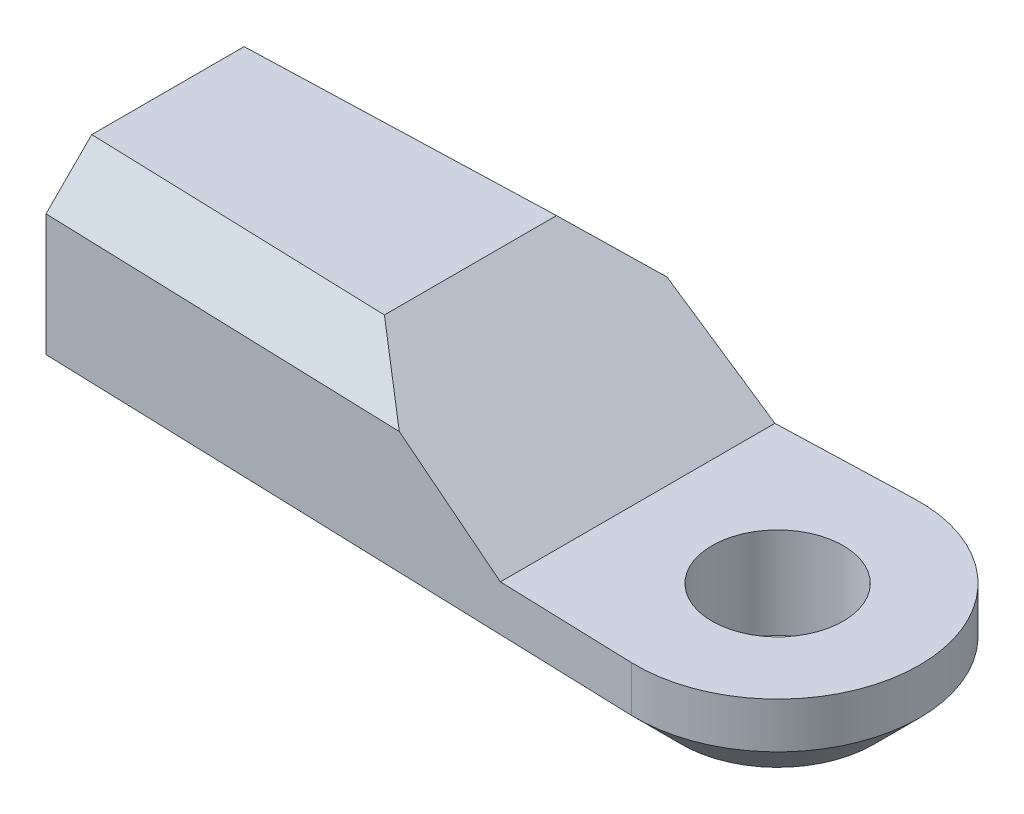
ISO-10303-21;
HEADER;
FILE_DESCRIPTION(('STEP AP214'),'2;1');
FILE_NAME('part.step','',(''),(''),'','','');
FILE_SCHEMA(('AUTOMOTIVE_DESIGN { 1 0 10303 214 1 1 1 1 }'));
ENDSEC;
DATA;
#1=APPLICATION_CONTEXT('core data for automotive mechanical design processes');
#2=APPLICATION_PROTOCOL_DEFINITION('international standard','automotive_design',2000,#1);
#3=PRODUCT_CONTEXT('',#1,'mechanical');
#4=PRODUCT('Part','Part','',(#3));
#5=PRODUCT_RELATED_PRODUCT_CATEGORY('part','',(#4));
#6=PRODUCT_DEFINITION_FORMATION('','',#4);
#7=PRODUCT_DEFINITION_CONTEXT('part definition',#1,'design');
#8=PRODUCT_DEFINITION('design','',#6,#7);
#9=PRODUCT_DEFINITION_SHAPE('','',#8);
#10=(LENGTH_UNIT() NAMED_UNIT(*) SI_UNIT(.MILLI.,.METRE.));
#11=(NAMED_UNIT(*) PLANE_ANGLE_UNIT() SI_UNIT($,.RADIAN.));
#12=(NAMED_UNIT(*) SI_UNIT($,.STERADIAN.) SOLID_ANGLE_UNIT());
#13=UNCERTAINTY_MEASURE_WITH_UNIT(LENGTH_MEASURE(1.E-05),#10,'distance_accuracy_value','');
#14=(GEOMETRIC_REPRESENTATION_CONTEXT(3) GLOBAL_UNCERTAINTY_ASSIGNED_CONTEXT((#13)) GLOBAL_UNIT_ASSIGNED_CONTEXT((#10,
#11,#12)) REPRESENTATION_CONTEXT('',''));
#15=CARTESIAN_POINT('',(0.,0.,0.));
#16=DIRECTION('',(0.,0.,1.));
#17=DIRECTION('',(1.,0.,0.));
#18=AXIS2_PLACEMENT_3D('',#15,#16,#17);
#19=CARTESIAN_POINT('',(-0.130356031743456,7.,3.99574730489311));
#20=DIRECTION('',(0.032606345651166,0.,-0.999468271744169));
#21=DIRECTION('',(-0.999468271744169,0.,-0.032606345651166));
#22=AXIS2_PLACEMENT_3D('',#19,#20,#21);
#23=PLANE('',#22);
#24=DIRECTION('',(0.,-1.,0.));
#25=VECTOR('',#24,1.);
#26=CARTESIAN_POINT('',(0.,7.,4.));
#27=LINE('',#26,#25);
#28=CARTESIAN_POINT('',(0.,5.5,4.));
#29=VERTEX_POINT('',#28);
#30=CARTESIAN_POINT('',(0.,1.5,4.));
#31=VERTEX_POINT('',#30);
#32=EDGE_CURVE('E154',#29,#31,#27,.T.);
#33=ORIENTED_EDGE('',*,*,#32,.T.);
#34=DIRECTION('',(0.999468271744169,0.,0.032606345651166));
#35=VECTOR('',#34,1.);
#36=CARTESIAN_POINT('',(-0.130356031743456,1.5,3.99574730489311));
#37=LINE('',#36,#35);
#38=CARTESIAN_POINT('',(19.8483804927221,1.5,4.64752746361039));
#39=VERTEX_POINT('',#38);
#40=EDGE_CURVE('E174',#31,#39,#37,.T.);
#41=ORIENTED_EDGE('',*,*,#40,.T.);
#42=DIRECTION('',(0.,-1.,0.));
#43=VECTOR('',#42,1.);
#44=CARTESIAN_POINT('',(19.8483804927221,7.,4.64752746361039));
#45=LINE('',#44,#43);
#46=CARTESIAN_POINT('',(19.8483804927221,3.,4.64752746361038));
#47=VERTEX_POINT('',#46);
#48=EDGE_CURVE('E138',#47,#39,#45,.T.);
#49=ORIENTED_EDGE('',*,*,#48,.F.);
#50=DIRECTION('',(0.999468271744169,0.,0.032606345651166));
#51=VECTOR('',#50,1.);
#52=CARTESIAN_POINT('',(-0.130356031743456,3.,3.99574730489311));
#53=LINE('',#52,#51);
#54=CARTESIAN_POINT('',(15.4080428224368,3.,4.50266725245775));
#55=VERTEX_POINT('',#54);
#56=EDGE_CURVE('E129',#55,#47,#53,.T.);
#57=ORIENTED_EDGE('',*,*,#56,.F.);
#58=DIRECTION('',(0.807631830837505,-0.589098134666087,0.0263479325754048));
#59=VECTOR('',#58,1.);
#60=CARTESIAN_POINT('',(3.35893964649233,11.7887870862983,4.10958101445662));
#61=LINE('',#60,#59);
#62=CARTESIAN_POINT('',(11.9806349623894,5.49999999999999,4.3908525520499));
#63=VERTEX_POINT('',#62);
#64=EDGE_CURVE('E117',#63,#55,#61,.T.);
#65=ORIENTED_EDGE('',*,*,#64,.F.);
#66=DIRECTION('',(-0.999468271744169,0.,-0.032606345651166));
#67=VECTOR('',#66,1.);
#68=CARTESIAN_POINT('',(0.,5.5,4.));
#69=LINE('',#68,#67);
#70=EDGE_CURVE('E170',#63,#29,#69,.T.);
#71=ORIENTED_EDGE('',*,*,#70,.T.);
#72=EDGE_LOOP('',(#33,#41,#49,#57,#65,#71));
#73=FACE_BOUND('',#72,.T.);
#74=ADVANCED_FACE('F37',(#73),#23,.F.);
#75=CARTESIAN_POINT('',(20.,7.,0.));
#76=DIRECTION('',(0.,-1.,0.));
#77=DIRECTION('',(0.,0.,-1.));
#78=AXIS2_PLACEMENT_3D('',#75,#76,#77);
#79=CYLINDRICAL_SURFACE('',#78,4.65);
#80=ORIENTED_EDGE('',*,*,#48,.T.);
#81=CARTESIAN_POINT('',(20.,1.5,0.));
#82=DIRECTION('',(0.,1.,0.));
#83=DIRECTION('',(0.,0.,1.));
#84=AXIS2_PLACEMENT_3D('',#81,#82,#83);
#85=CIRCLE('',#84,4.65);
#86=CARTESIAN_POINT('',(19.8483804927221,1.5,-4.64752746361039));
#87=VERTEX_POINT('',#86);
#88=EDGE_CURVE('E190',#39,#87,#85,.T.);
#89=ORIENTED_EDGE('',*,*,#88,.T.);
#90=DIRECTION('',(0.,-1.,0.));
#91=VECTOR('',#90,1.);
#92=CARTESIAN_POINT('',(19.8483804927221,7.,-4.64752746361039));
#93=LINE('',#92,#91);
#94=CARTESIAN_POINT('',(19.8483804927221,3.,-4.64752746361039));
#95=VERTEX_POINT('',#94);
#96=EDGE_CURVE('E164',#95,#87,#93,.T.);
#97=ORIENTED_EDGE('',*,*,#96,.F.);
#98=CARTESIAN_POINT('',(20.,3.,0.));
#99=DIRECTION('',(0.,1.,0.));
#100=DIRECTION('',(0.,0.,1.));
#101=AXIS2_PLACEMENT_3D('',#98,#99,#100);
#102=CIRCLE('',#101,4.65);
#103=EDGE_CURVE('E140',#47,#95,#102,.T.);
#104=ORIENTED_EDGE('',*,*,#103,.F.);
#105=EDGE_LOOP('',(#80,#89,#97,#104));
#106=FACE_BOUND('',#105,.T.);
#107=ADVANCED_FACE('F230',(#106),#79,.T.);
#108=CARTESIAN_POINT('',(-0.130356031743456,7.,-3.99574730489311));
#109=DIRECTION('',(-0.032606345651166,0.,-0.999468271744169));
#110=DIRECTION('',(-0.999468271744169,0.,0.032606345651166));
#111=AXIS2_PLACEMENT_3D('',#108,#109,#110);
#112=PLANE('',#111);
#113=ORIENTED_EDGE('',*,*,#96,.T.);
#114=DIRECTION('',(-0.999468271744169,0.,0.032606345651166));
#115=VECTOR('',#114,1.);
#116=CARTESIAN_POINT('',(0.,1.50000000000001,-4.));
#117=LINE('',#116,#115);
#118=CARTESIAN_POINT('',(0.,1.5,-4.));
#119=VERTEX_POINT('',#118);
#120=EDGE_CURVE('E195',#87,#119,#117,.T.);
#121=ORIENTED_EDGE('',*,*,#120,.T.);
#122=DIRECTION('',(0.,-1.,0.));
#123=VECTOR('',#122,1.);
#124=CARTESIAN_POINT('',(0.,7.,-4.));
#125=LINE('',#124,#123);
#126=CARTESIAN_POINT('',(0.,5.5,-4.));
#127=VERTEX_POINT('',#126);
#128=EDGE_CURVE('E161',#127,#119,#125,.T.);
#129=ORIENTED_EDGE('',*,*,#128,.F.);
#130=DIRECTION('',(0.999468271744169,0.,-0.032606345651166));
#131=VECTOR('',#130,1.);
#132=CARTESIAN_POINT('',(-0.130356031743456,5.5,-3.99574730489311));
#133=LINE('',#132,#131);
#134=CARTESIAN_POINT('',(11.9806349623894,5.49999999999999,-4.3908525520499));
#135=VERTEX_POINT('',#134);
#136=EDGE_CURVE('E192',#127,#135,#133,.T.);
#137=ORIENTED_EDGE('',*,*,#136,.T.);
#138=DIRECTION('',(0.807631830837505,-0.589098134666087,-0.0263479325754048));
#139=VECTOR('',#138,1.);
#140=CARTESIAN_POINT('',(3.35893964649233,11.7887870862983,-4.10958101445662));
#141=LINE('',#140,#139);
#142=CARTESIAN_POINT('',(15.4080428224368,3.,-4.50266725245775));
#143=VERTEX_POINT('',#142);
#144=EDGE_CURVE('E124',#135,#143,#141,.T.);
#145=ORIENTED_EDGE('',*,*,#144,.T.);
#146=DIRECTION('',(0.999468271744169,0.,-0.032606345651166));
#147=VECTOR('',#146,1.);
#148=CARTESIAN_POINT('',(-0.130356031743456,3.,-3.99574730489311));
#149=LINE('',#148,#147);
#150=EDGE_CURVE('E132',#143,#95,#149,.T.);
#151=ORIENTED_EDGE('',*,*,#150,.T.);
#152=EDGE_LOOP('',(#113,#121,#129,#137,#145,#151));
#153=FACE_BOUND('',#152,.T.);
#154=ADVANCED_FACE('F217',(#153),#112,.T.);
#155=CARTESIAN_POINT('',(20.,7.,0.));
#156=DIRECTION('',(0.,-1.,0.));
#157=DIRECTION('',(0.,0.,-1.));
#158=AXIS2_PLACEMENT_3D('',#155,#156,#157);
#159=CYLINDRICAL_SURFACE('',#158,2.15);
#160=CARTESIAN_POINT('',(20.,0.,0.));
#161=DIRECTION('',(0.,1.,0.));
#162=DIRECTION('',(0.,0.,1.));
#163=AXIS2_PLACEMENT_3D('',#160,#161,#162);
#164=CIRCLE('',#163,2.15);
#165=CARTESIAN_POINT('',(20.,0.,2.15));
#166=VERTEX_POINT('',#165);
#167=EDGE_CURVE('E149',#166,#166,#164,.T.);
#168=ORIENTED_EDGE('',*,*,#167,.F.);
#169=EDGE_LOOP('',(#168));
#170=FACE_BOUND('',#169,.T.);
#171=CARTESIAN_POINT('',(20.,3.,0.));
#172=DIRECTION('',(0.,1.,0.));
#173=DIRECTION('',(0.,0.,1.));
#174=AXIS2_PLACEMENT_3D('',#171,#172,#173);
#175=CIRCLE('',#174,2.15);
#176=CARTESIAN_POINT('',(20.,3.,2.15));
#177=VERTEX_POINT('',#176);
#178=EDGE_CURVE('E123',#177,#177,#175,.T.);
#179=ORIENTED_EDGE('',*,*,#178,.T.);
#180=EDGE_LOOP('',(#179));
#181=FACE_BOUND('',#180,.T.);
#182=ADVANCED_FACE('F237',(#170,#181),#159,.F.);
#183=CARTESIAN_POINT('',(0.,7.,0.));
#184=DIRECTION('',(0.,1.,0.));
#185=DIRECTION('',(0.,0.,1.));
#186=AXIS2_PLACEMENT_3D('',#183,#184,#185);
#187=PLANE('',#186);
#188=DIRECTION('',(0.,0.,-1.));
#189=VECTOR('',#188,1.);
#190=CARTESIAN_POINT('',(9.92419024636104,7.,0.));
#191=LINE('',#190,#189);
#192=CARTESIAN_POINT('',(9.92419024636104,7.,2.82296571509341));
#193=VERTEX_POINT('',#192);
#194=CARTESIAN_POINT('',(9.92419024636104,7.,-2.82296571509341));
#195=VERTEX_POINT('',#194);
#196=EDGE_CURVE('E168',#193,#195,#191,.T.);
#197=ORIENTED_EDGE('',*,*,#196,.T.);
#198=DIRECTION('',(-0.99946827174417,0.,0.032606345651166));
#199=VECTOR('',#198,1.);
#200=CARTESIAN_POINT('',(-0.0814465132667064,7.,-2.49654489727685));
#201=LINE('',#200,#199);
#202=CARTESIAN_POINT('',(0.,7.,-2.49920198328822));
#203=VERTEX_POINT('',#202);
#204=EDGE_CURVE('E11',#195,#203,#201,.T.);
#205=ORIENTED_EDGE('',*,*,#204,.T.);
#206=DIRECTION('',(0.,0.,-1.));
#207=VECTOR('',#206,1.);
#208=CARTESIAN_POINT('',(0.,7.,0.));
#209=LINE('',#208,#207);
#210=CARTESIAN_POINT('',(0.,7.,2.49920198328822));
#211=VERTEX_POINT('',#210);
#212=EDGE_CURVE('E151',#211,#203,#209,.T.);
#213=ORIENTED_EDGE('',*,*,#212,.F.);
#214=DIRECTION('',(0.99946827174417,0.,0.032606345651166));
#215=VECTOR('',#214,1.);
#216=CARTESIAN_POINT('',(9.97309976483779,7.,2.82456132418893));
#217=LINE('',#216,#215);
#218=EDGE_CURVE('E47',#211,#193,#217,.T.);
#219=ORIENTED_EDGE('',*,*,#218,.T.);
#220=EDGE_LOOP('',(#197,#205,#213,#219));
#221=FACE_BOUND('',#220,.T.);
#222=ADVANCED_FACE('F244',(#221),#187,.T.);
#223=CARTESIAN_POINT('',(0.,7.,0.));
#224=DIRECTION('',(-1.,0.,0.));
#225=DIRECTION('',(0.,0.,1.));
#226=AXIS2_PLACEMENT_3D('',#223,#224,#225);
#227=PLANE('',#226);
#228=CARTESIAN_POINT('',(0.,3.5,0.));
#229=DIRECTION('',(-1.,0.,0.));
#230=DIRECTION('',(0.,0.,1.));
#231=AXIS2_PLACEMENT_3D('',#228,#229,#230);
#232=CIRCLE('',#231,1.975);
#233=CARTESIAN_POINT('',(0.,3.5,1.975));
#234=VERTEX_POINT('',#233);
#235=EDGE_CURVE('E139',#234,#234,#232,.T.);
#236=ORIENTED_EDGE('',*,*,#235,.F.);
#237=EDGE_LOOP('',(#236));
#238=FACE_BOUND('',#237,.T.);
#239=DIRECTION('',(0.,0.,-1.));
#240=VECTOR('',#239,1.);
#241=CARTESIAN_POINT('',(0.,0.,0.));
#242=LINE('',#241,#240);
#243=CARTESIAN_POINT('',(0.,0.,2.49920198328822));
#244=VERTEX_POINT('',#243);
#245=CARTESIAN_POINT('',(0.,0.,-2.49920198328822));
#246=VERTEX_POINT('',#245);
#247=EDGE_CURVE('E155',#244,#246,#242,.T.);
#248=ORIENTED_EDGE('',*,*,#247,.F.);
#249=DIRECTION('',(0.,-0.706918711867468,-0.707294800498095));
#250=VECTOR('',#249,1.);
#251=CARTESIAN_POINT('',(0.,2.2485376414213,4.74893587178613));
#252=LINE('',#251,#250);
#253=EDGE_CURVE('E188',#244,#31,#252,.F.);
#254=ORIENTED_EDGE('',*,*,#253,.T.);
#255=ORIENTED_EDGE('',*,*,#32,.F.);
#256=DIRECTION('',(0.,0.706918711867468,-0.707294800498095));
#257=VECTOR('',#256,1.);
#258=CARTESIAN_POINT('',(0.,8.24960081489722,1.24893636683543));
#259=LINE('',#258,#257);
#260=EDGE_CURVE('E182',#29,#211,#259,.T.);
#261=ORIENTED_EDGE('',*,*,#260,.T.);
#262=ORIENTED_EDGE('',*,*,#212,.T.);
#263=DIRECTION('',(0.,0.706918711867468,0.707294800498095));
#264=VECTOR('',#263,1.);
#265=CARTESIAN_POINT('',(0.,8.24960081489722,-1.24893636683543));
#266=LINE('',#265,#264);
#267=EDGE_CURVE('E184',#203,#127,#266,.F.);
#268=ORIENTED_EDGE('',*,*,#267,.T.);
#269=ORIENTED_EDGE('',*,*,#128,.T.);
#270=DIRECTION('',(0.,-0.706918711867468,0.707294800498095));
#271=VECTOR('',#270,1.);
#272=CARTESIAN_POINT('',(0.,2.2485376414213,-4.74893587178613));
#273=LINE('',#272,#271);
#274=EDGE_CURVE('E186',#119,#246,#273,.T.);
#275=ORIENTED_EDGE('',*,*,#274,.T.);
#276=EDGE_LOOP('',(#248,#254,#255,#261,#262,#268,#269,#275));
#277=FACE_BOUND('',#276,.T.);
#278=ADVANCED_FACE('F222',(#238,#277),#227,.T.);
#279=CARTESIAN_POINT('',(0.,0.,0.));
#280=DIRECTION('',(0.,1.,0.));
#281=DIRECTION('',(0.,0.,1.));
#282=AXIS2_PLACEMENT_3D('',#279,#280,#281);
#283=PLANE('',#282);
#284=ORIENTED_EDGE('',*,*,#167,.T.);
#285=EDGE_LOOP('',(#284));
#286=FACE_BOUND('',#285,.T.);
#287=CARTESIAN_POINT('',(20.,0.,0.));
#288=DIRECTION('',(0.,1.,0.));
#289=DIRECTION('',(0.,0.,1.));
#290=AXIS2_PLACEMENT_3D('',#287,#288,#289);
#291=CIRCLE('',#290,3.14999999999999);
#292=CARTESIAN_POINT('',(19.8972900111988,0.,-3.14832505599413));
#293=VERTEX_POINT('',#292);
#294=CARTESIAN_POINT('',(19.8972900111988,0.,3.14832505599413));
#295=VERTEX_POINT('',#294);
#296=EDGE_CURVE('E178',#293,#295,#291,.F.);
#297=ORIENTED_EDGE('',*,*,#296,.T.);
#298=DIRECTION('',(-0.99946827174417,0.,-0.032606345651166));
#299=VECTOR('',#298,1.);
#300=CARTESIAN_POINT('',(-0.0814465132667065,0.,2.49654489727685));
#301=LINE('',#300,#299);
#302=EDGE_CURVE('E180',#295,#244,#301,.T.);
#303=ORIENTED_EDGE('',*,*,#302,.T.);
#304=ORIENTED_EDGE('',*,*,#247,.T.);
#305=DIRECTION('',(0.99946827174417,0.,-0.032606345651166));
#306=VECTOR('',#305,1.);
#307=CARTESIAN_POINT('',(19.8972900111988,0.,-3.14832505599413));
#308=LINE('',#307,#306);
#309=EDGE_CURVE('E176',#246,#293,#308,.T.);
#310=ORIENTED_EDGE('',*,*,#309,.T.);
#311=EDGE_LOOP('',(#297,#303,#304,#310));
#312=FACE_BOUND('',#311,.T.);
#313=ADVANCED_FACE('F278',(#286,#312),#283,.F.);
#314=CARTESIAN_POINT('',(10.,3.5,0.));
#315=DIRECTION('',(-1.,0.,0.));
#316=DIRECTION('',(0.,0.,1.));
#317=AXIS2_PLACEMENT_3D('',#314,#315,#316);
#318=CYLINDRICAL_SURFACE('',#317,1.975);
#319=CARTESIAN_POINT('',(10.,3.5,0.));
#320=DIRECTION('',(-1.,0.,0.));
#321=DIRECTION('',(0.,0.,1.));
#322=AXIS2_PLACEMENT_3D('',#319,#320,#321);
#323=CIRCLE('',#322,1.975);
#324=CARTESIAN_POINT('',(10.,3.5,1.975));
#325=VERTEX_POINT('',#324);
#326=EDGE_CURVE('E143',#325,#325,#323,.T.);
#327=ORIENTED_EDGE('',*,*,#326,.F.);
#328=EDGE_LOOP('',(#327));
#329=FACE_BOUND('',#328,.T.);
#330=ORIENTED_EDGE('',*,*,#235,.T.);
#331=EDGE_LOOP('',(#330));
#332=FACE_BOUND('',#331,.T.);
#333=ADVANCED_FACE('F282',(#329,#332),#318,.F.);
#334=CARTESIAN_POINT('',(10.,3.5,0.));
#335=DIRECTION('',(-1.,0.,0.));
#336=DIRECTION('',(0.,0.,1.));
#337=AXIS2_PLACEMENT_3D('',#334,#335,#336);
#338=PLANE('',#337);
#339=ORIENTED_EDGE('',*,*,#326,.T.);
#340=EDGE_LOOP('',(#339));
#341=FACE_BOUND('',#340,.T.);
#342=ADVANCED_FACE('F289',(#341),#338,.T.);
#343=CARTESIAN_POINT('',(15.4080428224368,3.,10.));
#344=DIRECTION('',(0.,1.,0.));
#345=DIRECTION('',(0.,0.,1.));
#346=AXIS2_PLACEMENT_3D('',#343,#344,#345);
#347=PLANE('',#346);
#348=ORIENTED_EDGE('',*,*,#178,.F.);
#349=EDGE_LOOP('',(#348));
#350=FACE_BOUND('',#349,.T.);
#351=ORIENTED_EDGE('',*,*,#56,.T.);
#352=ORIENTED_EDGE('',*,*,#103,.T.);
#353=ORIENTED_EDGE('',*,*,#150,.F.);
#354=DIRECTION('',(0.,0.,-1.));
#355=VECTOR('',#354,1.);
#356=CARTESIAN_POINT('',(15.4080428224368,3.,10.));
#357=LINE('',#356,#355);
#358=EDGE_CURVE('E120',#55,#143,#357,.T.);
#359=ORIENTED_EDGE('',*,*,#358,.F.);
#360=EDGE_LOOP('',(#351,#352,#353,#359));
#361=FACE_BOUND('',#360,.T.);
#362=ADVANCED_FACE('F128',(#350,#361),#347,.T.);
#363=CARTESIAN_POINT('',(9.92419024636104,7.,10.));
#364=DIRECTION('',(0.589302721146258,0.807912311361584,0.));
#365=DIRECTION('',(-0.807912311361584,0.589302721146258,0.));
#366=AXIS2_PLACEMENT_3D('',#363,#364,#365);
#367=PLANE('',#366);
#368=ORIENTED_EDGE('',*,*,#144,.F.);
#369=DIRECTION('',(0.687884421548169,-0.501752672600418,-0.524460940518623));
#370=VECTOR('',#369,1.);
#371=CARTESIAN_POINT('',(5.29806800265604,10.374359306366,0.704109977981803));
#372=LINE('',#371,#370);
#373=EDGE_CURVE('E55',#135,#195,#372,.F.);
#374=ORIENTED_EDGE('',*,*,#373,.T.);
#375=ORIENTED_EDGE('',*,*,#196,.F.);
#376=DIRECTION('',(0.687884421548169,-0.501752672600418,0.524460940518623));
#377=VECTOR('',#376,1.);
#378=CARTESIAN_POINT('',(12.5134382165213,5.111365734771,4.79707558461177));
#379=LINE('',#378,#377);
#380=EDGE_CURVE('E63',#193,#63,#379,.T.);
#381=ORIENTED_EDGE('',*,*,#380,.T.);
#382=ORIENTED_EDGE('',*,*,#64,.T.);
#383=ORIENTED_EDGE('',*,*,#358,.T.);
#384=EDGE_LOOP('',(#368,#374,#375,#381,#382,#383));
#385=FACE_BOUND('',#384,.T.);
#386=ADVANCED_FACE('F119',(#385),#367,.T.);
#387=CARTESIAN_POINT('',(-0.0814465132667064,0.,-2.49654489727685));
#388=DIRECTION('',(-0.023056168119652,-0.707106781186547,-0.706730792531101));
#389=DIRECTION('',(-0.999468271744169,0.,0.032606345651166));
#390=AXIS2_PLACEMENT_3D('',#387,#388,#389);
#391=PLANE('',#390);
#392=ORIENTED_EDGE('',*,*,#274,.F.);
#393=ORIENTED_EDGE('',*,*,#120,.F.);
#394=DIRECTION('',(-0.0230561681196511,0.707106781186548,-0.706730792531101));
#395=VECTOR('',#394,1.);
#396=CARTESIAN_POINT('',(19.8972900111988,0.,-3.14832505599413));
#397=LINE('',#396,#395);
#398=EDGE_CURVE('E42',#293,#87,#397,.T.);
#399=ORIENTED_EDGE('',*,*,#398,.F.);
#400=ORIENTED_EDGE('',*,*,#309,.F.);
#401=EDGE_LOOP('',(#392,#393,#399,#400));
#402=FACE_BOUND('',#401,.T.);
#403=ADVANCED_FACE('F214',(#402),#391,.T.);
#404=CARTESIAN_POINT('',(20.,1.5,0.));
#405=DIRECTION('',(0.,1.,0.));
#406=DIRECTION('',(0.,0.,1.));
#407=AXIS2_PLACEMENT_3D('',#404,#405,#406);
#408=CONICAL_SURFACE('',#407,4.65,0.785398163397448);
#409=ORIENTED_EDGE('',*,*,#398,.T.);
#410=ORIENTED_EDGE('',*,*,#88,.F.);
#411=DIRECTION('',(-0.0230561681196512,0.707106781186548,0.706730792531101));
#412=VECTOR('',#411,1.);
#413=CARTESIAN_POINT('',(19.8972900111988,0.,3.14832505599413));
#414=LINE('',#413,#412);
#415=EDGE_CURVE('E199',#295,#39,#414,.T.);
#416=ORIENTED_EDGE('',*,*,#415,.F.);
#417=ORIENTED_EDGE('',*,*,#296,.F.);
#418=EDGE_LOOP('',(#409,#410,#416,#417));
#419=FACE_BOUND('',#418,.T.);
#420=ADVANCED_FACE('F209',(#419),#408,.T.);
#421=CARTESIAN_POINT('',(-0.130356031743456,1.5,3.99574730489311));
#422=DIRECTION('',(0.023056168119652,0.707106781186547,-0.706730792531101));
#423=DIRECTION('',(0.999468271744169,0.,0.032606345651166));
#424=AXIS2_PLACEMENT_3D('',#421,#422,#423);
#425=PLANE('',#424);
#426=ORIENTED_EDGE('',*,*,#253,.F.);
#427=ORIENTED_EDGE('',*,*,#302,.F.);
#428=ORIENTED_EDGE('',*,*,#415,.T.);
#429=ORIENTED_EDGE('',*,*,#40,.F.);
#430=EDGE_LOOP('',(#426,#427,#428,#429));
#431=FACE_BOUND('',#430,.T.);
#432=ADVANCED_FACE('F247',(#431),#425,.F.);
#433=CARTESIAN_POINT('',(-0.130356031743456,5.5,-3.99574730489311));
#434=DIRECTION('',(0.023056168119652,-0.707106781186547,0.706730792531101));
#435=DIRECTION('',(0.999468271744169,0.,-0.032606345651166));
#436=AXIS2_PLACEMENT_3D('',#433,#434,#435);
#437=PLANE('',#436);
#438=ORIENTED_EDGE('',*,*,#267,.F.);
#439=ORIENTED_EDGE('',*,*,#204,.F.);
#440=ORIENTED_EDGE('',*,*,#373,.F.);
#441=ORIENTED_EDGE('',*,*,#136,.F.);
#442=EDGE_LOOP('',(#438,#439,#440,#441));
#443=FACE_BOUND('',#442,.T.);
#444=ADVANCED_FACE('F227',(#443),#437,.F.);
#445=CARTESIAN_POINT('',(-0.0814465132667064,7.,2.49654489727685));
#446=DIRECTION('',(-0.023056168119652,0.707106781186547,0.706730792531101));
#447=DIRECTION('',(-0.999468271744169,0.,-0.032606345651166));
#448=AXIS2_PLACEMENT_3D('',#445,#446,#447);
#449=PLANE('',#448);
#450=ORIENTED_EDGE('',*,*,#260,.F.);
#451=ORIENTED_EDGE('',*,*,#70,.F.);
#452=ORIENTED_EDGE('',*,*,#380,.F.);
#453=ORIENTED_EDGE('',*,*,#218,.F.);
#454=EDGE_LOOP('',(#450,#451,#452,#453));
#455=FACE_BOUND('',#454,.T.);
#456=ADVANCED_FACE('F40',(#455),#449,.T.);
#457=CLOSED_SHELL('',(#74,#107,#154,#182,#222,#278,#313,#333,#342,#362,#386,#403,#420,#432,#444,#456));
#458=MANIFOLD_SOLID_BREP('B2',#457);
#459=ADVANCED_BREP_SHAPE_REPRESENTATION('',(#18,#458),#14);
#460=SHAPE_DEFINITION_REPRESENTATION(#9,#459);
ENDSEC;
END-ISO-10303-21;
